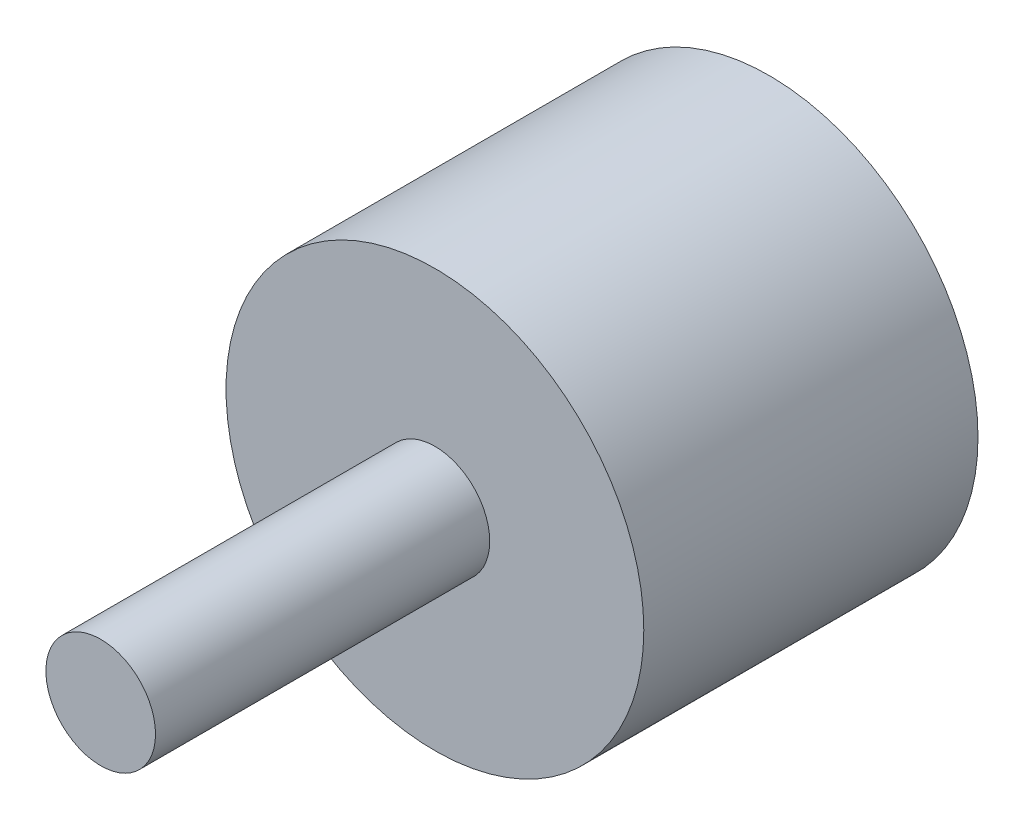
ISO-10303-21;
HEADER;
FILE_DESCRIPTION(('STEP AP214'),'2;1');
FILE_NAME('part.step','',(''),(''),'','','');
FILE_SCHEMA(('AUTOMOTIVE_DESIGN { 1 0 10303 214 1 1 1 1 }'));
ENDSEC;
DATA;
#1=APPLICATION_CONTEXT('core data for automotive mechanical design processes');
#2=APPLICATION_PROTOCOL_DEFINITION('international standard','automotive_design',2000,#1);
#3=PRODUCT_CONTEXT('',#1,'mechanical');
#4=PRODUCT('Part','Part','',(#3));
#5=PRODUCT_RELATED_PRODUCT_CATEGORY('part','',(#4));
#6=PRODUCT_DEFINITION_FORMATION('','',#4);
#7=PRODUCT_DEFINITION_CONTEXT('part definition',#1,'design');
#8=PRODUCT_DEFINITION('design','',#6,#7);
#9=PRODUCT_DEFINITION_SHAPE('','',#8);
#10=(LENGTH_UNIT() NAMED_UNIT(*) SI_UNIT(.MILLI.,.METRE.));
#11=(NAMED_UNIT(*) PLANE_ANGLE_UNIT() SI_UNIT($,.RADIAN.));
#12=(NAMED_UNIT(*) SI_UNIT($,.STERADIAN.) SOLID_ANGLE_UNIT());
#13=UNCERTAINTY_MEASURE_WITH_UNIT(LENGTH_MEASURE(1.E-05),#10,'distance_accuracy_value','');
#14=(GEOMETRIC_REPRESENTATION_CONTEXT(3) GLOBAL_UNCERTAINTY_ASSIGNED_CONTEXT((#13)) GLOBAL_UNIT_ASSIGNED_CONTEXT((#10,
#11,#12)) REPRESENTATION_CONTEXT('',''));
#15=CARTESIAN_POINT('',(0.,0.,0.));
#16=DIRECTION('',(0.,0.,1.));
#17=DIRECTION('',(1.,0.,0.));
#18=AXIS2_PLACEMENT_3D('',#15,#16,#17);
#19=CARTESIAN_POINT('',(0.,0.,12.7));
#20=DIRECTION('',(0.,0.,1.));
#21=DIRECTION('',(1.,0.,0.));
#22=AXIS2_PLACEMENT_3D('',#19,#20,#21);
#23=PLANE('',#22);
#24=CARTESIAN_POINT('',(0.,0.,12.7));
#25=DIRECTION('',(0.,0.,1.));
#26=DIRECTION('',(1.,0.,0.));
#27=AXIS2_PLACEMENT_3D('',#24,#25,#26);
#28=CIRCLE('',#27,2.0828);
#29=CARTESIAN_POINT('',(2.0828,0.,12.7));
#30=VERTEX_POINT('',#29);
#31=EDGE_CURVE('E17',#30,#30,#28,.F.);
#32=ORIENTED_EDGE('',*,*,#31,.F.);
#33=EDGE_LOOP('',(#32));
#34=FACE_BOUND('',#33,.T.);
#35=ADVANCED_FACE('F14',(#34),#23,.T.);
#36=CARTESIAN_POINT('',(0.,0.,-7.9375));
#37=DIRECTION('',(0.,0.,1.));
#38=DIRECTION('',(1.,0.,0.));
#39=AXIS2_PLACEMENT_3D('',#36,#37,#38);
#40=PLANE('',#39);
#41=CARTESIAN_POINT('',(0.,0.,-7.9375));
#42=DIRECTION('',(0.,0.,1.));
#43=DIRECTION('',(1.,0.,0.));
#44=AXIS2_PLACEMENT_3D('',#41,#42,#43);
#45=CIRCLE('',#44,2.0828);
#46=CARTESIAN_POINT('',(2.0828,0.,-7.9375));
#47=VERTEX_POINT('',#46);
#48=EDGE_CURVE('E33',#47,#47,#45,.F.);
#49=ORIENTED_EDGE('',*,*,#48,.T.);
#50=EDGE_LOOP('',(#49));
#51=FACE_BOUND('',#50,.T.);
#52=ADVANCED_FACE('F43',(#51),#40,.F.);
#53=CARTESIAN_POINT('',(0.,0.,-13.97));
#54=DIRECTION('',(0.,0.,1.));
#55=DIRECTION('',(1.,0.,0.));
#56=AXIS2_PLACEMENT_3D('',#53,#54,#55);
#57=CYLINDRICAL_SURFACE('',#56,2.0828);
#58=CARTESIAN_POINT('',(0.,0.,0.));
#59=DIRECTION('',(0.,0.,1.));
#60=DIRECTION('',(1.,0.,0.));
#61=AXIS2_PLACEMENT_3D('',#58,#59,#60);
#62=CIRCLE('',#61,2.0828);
#63=CARTESIAN_POINT('',(2.0828,0.,0.));
#64=VERTEX_POINT('',#63);
#65=EDGE_CURVE('E31',#64,#64,#62,.F.);
#66=ORIENTED_EDGE('',*,*,#65,.F.);
#67=EDGE_LOOP('',(#66));
#68=FACE_BOUND('',#67,.T.);
#69=ORIENTED_EDGE('',*,*,#31,.T.);
#70=EDGE_LOOP('',(#69));
#71=FACE_BOUND('',#70,.T.);
#72=ADVANCED_FACE('F40',(#68,#71),#57,.T.);
#73=CARTESIAN_POINT('',(0.,0.,-13.97));
#74=DIRECTION('',(0.,0.,1.));
#75=DIRECTION('',(1.,0.,0.));
#76=AXIS2_PLACEMENT_3D('',#73,#74,#75);
#77=CYLINDRICAL_SURFACE('',#76,2.0828);
#78=ORIENTED_EDGE('',*,*,#48,.F.);
#79=EDGE_LOOP('',(#78));
#80=FACE_BOUND('',#79,.T.);
#81=CARTESIAN_POINT('',(0.,0.,-12.7));
#82=DIRECTION('',(0.,0.,1.));
#83=DIRECTION('',(1.,0.,0.));
#84=AXIS2_PLACEMENT_3D('',#81,#82,#83);
#85=CIRCLE('',#84,2.0828);
#86=CARTESIAN_POINT('',(2.0828,0.,-12.7));
#87=VERTEX_POINT('',#86);
#88=EDGE_CURVE('E26',#87,#87,#85,.F.);
#89=ORIENTED_EDGE('',*,*,#88,.T.);
#90=EDGE_LOOP('',(#89));
#91=FACE_BOUND('',#90,.T.);
#92=ADVANCED_FACE('F62',(#80,#91),#77,.F.);
#93=CARTESIAN_POINT('',(0.,0.,0.));
#94=DIRECTION('',(0.,0.,1.));
#95=DIRECTION('',(1.,0.,0.));
#96=AXIS2_PLACEMENT_3D('',#93,#94,#95);
#97=PLANE('',#96);
#98=ORIENTED_EDGE('',*,*,#65,.T.);
#99=EDGE_LOOP('',(#98));
#100=FACE_BOUND('',#99,.T.);
#101=CARTESIAN_POINT('',(0.,0.,0.));
#102=DIRECTION('',(0.,0.,1.));
#103=DIRECTION('',(1.,0.,0.));
#104=AXIS2_PLACEMENT_3D('',#101,#102,#103);
#105=CIRCLE('',#104,7.9375);
#106=CARTESIAN_POINT('',(7.9375,0.,0.));
#107=VERTEX_POINT('',#106);
#108=EDGE_CURVE('E21',#107,#107,#105,.F.);
#109=ORIENTED_EDGE('',*,*,#108,.F.);
#110=EDGE_LOOP('',(#109));
#111=FACE_BOUND('',#110,.T.);
#112=ADVANCED_FACE('F55',(#100,#111),#97,.T.);
#113=CARTESIAN_POINT('',(0.,0.,-12.7));
#114=DIRECTION('',(0.,0.,1.));
#115=DIRECTION('',(1.,0.,0.));
#116=AXIS2_PLACEMENT_3D('',#113,#114,#115);
#117=PLANE('',#116);
#118=ORIENTED_EDGE('',*,*,#88,.F.);
#119=EDGE_LOOP('',(#118));
#120=FACE_BOUND('',#119,.T.);
#121=CARTESIAN_POINT('',(0.,0.,-12.7));
#122=DIRECTION('',(0.,0.,1.));
#123=DIRECTION('',(1.,0.,0.));
#124=AXIS2_PLACEMENT_3D('',#121,#122,#123);
#125=CIRCLE('',#124,7.9375);
#126=CARTESIAN_POINT('',(7.9375,0.,-12.7));
#127=VERTEX_POINT('',#126);
#128=EDGE_CURVE('E10',#127,#127,#125,.T.);
#129=ORIENTED_EDGE('',*,*,#128,.F.);
#130=EDGE_LOOP('',(#129));
#131=FACE_BOUND('',#130,.T.);
#132=ADVANCED_FACE('F50',(#120,#131),#117,.F.);
#133=CARTESIAN_POINT('',(0.,0.,-13.97));
#134=DIRECTION('',(0.,0.,1.));
#135=DIRECTION('',(1.,0.,0.));
#136=AXIS2_PLACEMENT_3D('',#133,#134,#135);
#137=CYLINDRICAL_SURFACE('',#136,7.9375);
#138=ORIENTED_EDGE('',*,*,#128,.T.);
#139=EDGE_LOOP('',(#138));
#140=FACE_BOUND('',#139,.T.);
#141=ORIENTED_EDGE('',*,*,#108,.T.);
#142=EDGE_LOOP('',(#141));
#143=FACE_BOUND('',#142,.T.);
#144=ADVANCED_FACE('F48',(#140,#143),#137,.T.);
#145=CLOSED_SHELL('',(#35,#52,#72,#92,#112,#132,#144));
#146=MANIFOLD_SOLID_BREP('B1',#145);
#147=ADVANCED_BREP_SHAPE_REPRESENTATION('',(#18,#146),#14);
#148=SHAPE_DEFINITION_REPRESENTATION(#9,#147);
ENDSEC;
END-ISO-10303-21;
